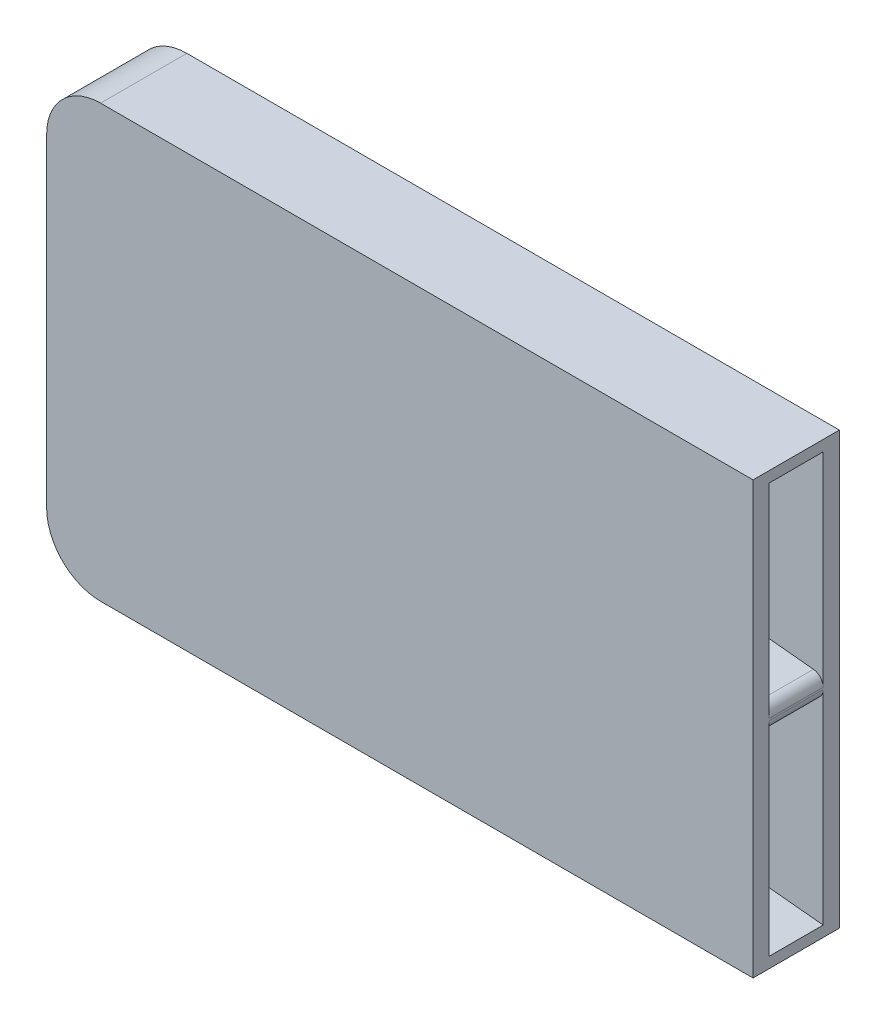
ISO-10303-21;
HEADER;
FILE_DESCRIPTION(('STEP AP214'),'2;1');
FILE_NAME('part.step','',(''),(''),'','','');
FILE_SCHEMA(('AUTOMOTIVE_DESIGN { 1 0 10303 214 1 1 1 1 }'));
ENDSEC;
DATA;
#1=APPLICATION_CONTEXT('core data for automotive mechanical design processes');
#2=APPLICATION_PROTOCOL_DEFINITION('international standard','automotive_design',2000,#1);
#3=PRODUCT_CONTEXT('',#1,'mechanical');
#4=PRODUCT('Part','Part','',(#3));
#5=PRODUCT_RELATED_PRODUCT_CATEGORY('part','',(#4));
#6=PRODUCT_DEFINITION_FORMATION('','',#4);
#7=PRODUCT_DEFINITION_CONTEXT('part definition',#1,'design');
#8=PRODUCT_DEFINITION('design','',#6,#7);
#9=PRODUCT_DEFINITION_SHAPE('','',#8);
#10=(LENGTH_UNIT() NAMED_UNIT(*) SI_UNIT(.MILLI.,.METRE.));
#11=(NAMED_UNIT(*) PLANE_ANGLE_UNIT() SI_UNIT($,.RADIAN.));
#12=(NAMED_UNIT(*) SI_UNIT($,.STERADIAN.) SOLID_ANGLE_UNIT());
#13=UNCERTAINTY_MEASURE_WITH_UNIT(LENGTH_MEASURE(1.E-05),#10,'distance_accuracy_value','');
#14=(GEOMETRIC_REPRESENTATION_CONTEXT(3) GLOBAL_UNCERTAINTY_ASSIGNED_CONTEXT((#13)) GLOBAL_UNIT_ASSIGNED_CONTEXT((#10,
#11,#12)) REPRESENTATION_CONTEXT('',''));
#15=CARTESIAN_POINT('',(0.,0.,0.));
#16=DIRECTION('',(0.,0.,1.));
#17=DIRECTION('',(1.,0.,0.));
#18=AXIS2_PLACEMENT_3D('',#15,#16,#17);
#19=CARTESIAN_POINT('',(0.,0.,0.));
#20=DIRECTION('',(0.,0.,1.));
#21=DIRECTION('',(1.,0.,0.));
#22=AXIS2_PLACEMENT_3D('',#19,#20,#21);
#23=PLANE('',#22);
#24=DIRECTION('',(0.995112116617697,-0.0987515840918325,0.));
#25=VECTOR('',#24,1.);
#26=CARTESIAN_POINT('',(0.737016733987305,7.42686093479516,0.));
#27=LINE('',#26,#25);
#28=CARTESIAN_POINT('',(0.,7.5,0.));
#29=VERTEX_POINT('',#28);
#30=CARTESIAN_POINT('',(65.5,1.00000000000001,0.));
#31=VERTEX_POINT('',#30);
#32=EDGE_CURVE('E177',#29,#31,#27,.T.);
#33=ORIENTED_EDGE('',*,*,#32,.T.);
#34=DIRECTION('',(0.,-1.,0.));
#35=VECTOR('',#34,1.);
#36=CARTESIAN_POINT('',(65.5,0.,0.));
#37=LINE('',#36,#35);
#38=CARTESIAN_POINT('',(65.5,19.9056752509169,0.));
#39=VERTEX_POINT('',#38);
#40=EDGE_CURVE('E234',#39,#31,#37,.T.);
#41=ORIENTED_EDGE('',*,*,#40,.F.);
#42=CARTESIAN_POINT('',(64.5,19.9056752509169,0.));
#43=DIRECTION('',(0.,0.,1.));
#44=DIRECTION('',(1.,0.,0.));
#45=AXIS2_PLACEMENT_3D('',#42,#43,#44);
#46=CIRCLE('',#45,1.);
#47=CARTESIAN_POINT('',(64.5987515840918,18.9105631342992,0.));
#48=VERTEX_POINT('',#47);
#49=EDGE_CURVE('E43',#39,#48,#46,.F.);
#50=ORIENTED_EDGE('',*,*,#49,.T.);
#51=DIRECTION('',(0.995112116617697,0.0987515840918326,0.));
#52=VECTOR('',#51,1.);
#53=CARTESIAN_POINT('',(-1.22836122331218,12.3781015579919,0.));
#54=LINE('',#53,#52);
#55=CARTESIAN_POINT('',(0.,12.5,0.));
#56=VERTEX_POINT('',#55);
#57=EDGE_CURVE('E201',#56,#48,#54,.T.);
#58=ORIENTED_EDGE('',*,*,#57,.F.);
#59=DIRECTION('',(0.,1.,0.));
#60=VECTOR('',#59,1.);
#61=CARTESIAN_POINT('',(0.,0.,0.));
#62=LINE('',#61,#60);
#63=EDGE_CURVE('E233',#29,#56,#62,.T.);
#64=ORIENTED_EDGE('',*,*,#63,.F.);
#65=EDGE_LOOP('',(#33,#41,#50,#58,#64));
#66=FACE_BOUND('',#65,.T.);
#67=ADVANCED_FACE('F35',(#66),#23,.T.);
#68=CARTESIAN_POINT('',(0.,0.,-1.5));
#69=DIRECTION('',(1.,0.,0.));
#70=DIRECTION('',(0.,1.,0.));
#71=AXIS2_PLACEMENT_3D('',#68,#69,#70);
#72=PLANE('',#71);
#73=DIRECTION('',(0.,1.,0.));
#74=VECTOR('',#73,1.);
#75=CARTESIAN_POINT('',(0.,0.,6.5));
#76=LINE('',#75,#74);
#77=CARTESIAN_POINT('',(0.,5.,6.5));
#78=VERTEX_POINT('',#77);
#79=CARTESIAN_POINT('',(0.,35.,6.5));
#80=VERTEX_POINT('',#79);
#81=EDGE_CURVE('E170',#78,#80,#76,.T.);
#82=ORIENTED_EDGE('',*,*,#81,.T.);
#83=DIRECTION('',(0.,0.,1.));
#84=VECTOR('',#83,1.);
#85=CARTESIAN_POINT('',(0.,35.,-1.5));
#86=LINE('',#85,#84);
#87=CARTESIAN_POINT('',(0.,35.,-1.5));
#88=VERTEX_POINT('',#87);
#89=EDGE_CURVE('E253',#80,#88,#86,.F.);
#90=ORIENTED_EDGE('',*,*,#89,.T.);
#91=DIRECTION('',(0.,1.,0.));
#92=VECTOR('',#91,1.);
#93=CARTESIAN_POINT('',(0.,0.,-1.5));
#94=LINE('',#93,#92);
#95=CARTESIAN_POINT('',(0.,5.,-1.5));
#96=VERTEX_POINT('',#95);
#97=EDGE_CURVE('E217',#96,#88,#94,.T.);
#98=ORIENTED_EDGE('',*,*,#97,.F.);
#99=DIRECTION('',(0.,0.,1.));
#100=VECTOR('',#99,1.);
#101=CARTESIAN_POINT('',(0.,5.,-1.5));
#102=LINE('',#101,#100);
#103=EDGE_CURVE('E250',#96,#78,#102,.T.);
#104=ORIENTED_EDGE('',*,*,#103,.T.);
#105=EDGE_LOOP('',(#82,#90,#98,#104));
#106=FACE_BOUND('',#105,.T.);
#107=DIRECTION('',(0.,1.,0.));
#108=VECTOR('',#107,1.);
#109=CARTESIAN_POINT('',(0.,0.,5.));
#110=LINE('',#109,#108);
#111=CARTESIAN_POINT('',(0.,27.5,5.));
#112=VERTEX_POINT('',#111);
#113=CARTESIAN_POINT('',(0.,32.5,5.));
#114=VERTEX_POINT('',#113);
#115=EDGE_CURVE('E181',#112,#114,#110,.T.);
#116=ORIENTED_EDGE('',*,*,#115,.F.);
#117=DIRECTION('',(0.,0.,-1.));
#118=VECTOR('',#117,1.);
#119=CARTESIAN_POINT('',(0.,27.5,5.));
#120=LINE('',#119,#118);
#121=CARTESIAN_POINT('',(0.,27.5,0.));
#122=VERTEX_POINT('',#121);
#123=EDGE_CURVE('E209',#112,#122,#120,.T.);
#124=ORIENTED_EDGE('',*,*,#123,.T.);
#125=CARTESIAN_POINT('',(0.,32.5,0.));
#126=VERTEX_POINT('',#125);
#127=EDGE_CURVE('E228',#122,#126,#62,.T.);
#128=ORIENTED_EDGE('',*,*,#127,.T.);
#129=DIRECTION('',(0.,0.,-1.));
#130=VECTOR('',#129,1.);
#131=CARTESIAN_POINT('',(0.,32.5,5.));
#132=LINE('',#131,#130);
#133=EDGE_CURVE('E225',#114,#126,#132,.T.);
#134=ORIENTED_EDGE('',*,*,#133,.F.);
#135=EDGE_LOOP('',(#116,#124,#128,#134));
#136=FACE_BOUND('',#135,.T.);
#137=DIRECTION('',(0.,0.,-1.));
#138=VECTOR('',#137,1.);
#139=CARTESIAN_POINT('',(0.,12.5,5.));
#140=LINE('',#139,#138);
#141=CARTESIAN_POINT('',(0.,12.5,5.));
#142=VERTEX_POINT('',#141);
#143=EDGE_CURVE('E203',#142,#56,#140,.T.);
#144=ORIENTED_EDGE('',*,*,#143,.F.);
#145=CARTESIAN_POINT('',(0.,7.5,5.));
#146=VERTEX_POINT('',#145);
#147=EDGE_CURVE('E183',#146,#142,#110,.T.);
#148=ORIENTED_EDGE('',*,*,#147,.F.);
#149=DIRECTION('',(0.,0.,-1.));
#150=VECTOR('',#149,1.);
#151=CARTESIAN_POINT('',(0.,7.5,5.));
#152=LINE('',#151,#150);
#153=EDGE_CURVE('E194',#146,#29,#152,.T.);
#154=ORIENTED_EDGE('',*,*,#153,.T.);
#155=ORIENTED_EDGE('',*,*,#63,.T.);
#156=EDGE_LOOP('',(#144,#148,#154,#155));
#157=FACE_BOUND('',#156,.T.);
#158=ADVANCED_FACE('F296',(#106,#136,#157),#72,.F.);
#159=CARTESIAN_POINT('',(0.,40.,-1.5));
#160=DIRECTION('',(0.,-1.,0.));
#161=DIRECTION('',(1.,0.,0.));
#162=AXIS2_PLACEMENT_3D('',#159,#160,#161);
#163=PLANE('',#162);
#164=DIRECTION('',(1.,0.,0.));
#165=VECTOR('',#164,1.);
#166=CARTESIAN_POINT('',(0.,40.,-1.5));
#167=LINE('',#166,#165);
#168=CARTESIAN_POINT('',(5.00000000000001,40.,-1.5));
#169=VERTEX_POINT('',#168);
#170=CARTESIAN_POINT('',(65.5,40.,-1.5));
#171=VERTEX_POINT('',#170);
#172=EDGE_CURVE('E161',#169,#171,#167,.T.);
#173=ORIENTED_EDGE('',*,*,#172,.F.);
#174=DIRECTION('',(0.,0.,1.));
#175=VECTOR('',#174,1.);
#176=CARTESIAN_POINT('',(5.00000000000001,40.,-1.5));
#177=LINE('',#176,#175);
#178=CARTESIAN_POINT('',(5.00000000000001,40.,6.5));
#179=VERTEX_POINT('',#178);
#180=EDGE_CURVE('E244',#169,#179,#177,.T.);
#181=ORIENTED_EDGE('',*,*,#180,.T.);
#182=DIRECTION('',(1.,0.,0.));
#183=VECTOR('',#182,1.);
#184=CARTESIAN_POINT('',(0.,40.,6.5));
#185=LINE('',#184,#183);
#186=CARTESIAN_POINT('',(65.5,40.,6.5));
#187=VERTEX_POINT('',#186);
#188=EDGE_CURVE('E175',#179,#187,#185,.T.);
#189=ORIENTED_EDGE('',*,*,#188,.T.);
#190=DIRECTION('',(0.,0.,1.));
#191=VECTOR('',#190,1.);
#192=CARTESIAN_POINT('',(65.5,40.,-1.5));
#193=LINE('',#192,#191);
#194=EDGE_CURVE('E160',#171,#187,#193,.T.);
#195=ORIENTED_EDGE('',*,*,#194,.F.);
#196=EDGE_LOOP('',(#173,#181,#189,#195));
#197=FACE_BOUND('',#196,.T.);
#198=ADVANCED_FACE('F334',(#197),#163,.F.);
#199=CARTESIAN_POINT('',(65.5,0.,-1.5));
#200=DIRECTION('',(-1.,0.,0.));
#201=DIRECTION('',(0.,0.,1.));
#202=AXIS2_PLACEMENT_3D('',#199,#200,#201);
#203=PLANE('',#202);
#204=CARTESIAN_POINT('',(65.5,39.,0.));
#205=VERTEX_POINT('',#204);
#206=CARTESIAN_POINT('',(65.5,20.0943247490831,0.));
#207=VERTEX_POINT('',#206);
#208=EDGE_CURVE('E291',#205,#207,#37,.T.);
#209=ORIENTED_EDGE('',*,*,#208,.T.);
#210=DIRECTION('',(0.,0.,-1.));
#211=VECTOR('',#210,1.);
#212=CARTESIAN_POINT('',(65.5,20.0943247490831,5.));
#213=LINE('',#212,#211);
#214=CARTESIAN_POINT('',(65.5,20.0943247490831,5.));
#215=VERTEX_POINT('',#214);
#216=EDGE_CURVE('E267',#207,#215,#213,.F.);
#217=ORIENTED_EDGE('',*,*,#216,.T.);
#218=DIRECTION('',(0.,-1.,0.));
#219=VECTOR('',#218,1.);
#220=CARTESIAN_POINT('',(65.5,0.,5.));
#221=LINE('',#220,#219);
#222=CARTESIAN_POINT('',(65.5,39.,5.));
#223=VERTEX_POINT('',#222);
#224=EDGE_CURVE('E186',#223,#215,#221,.T.);
#225=ORIENTED_EDGE('',*,*,#224,.F.);
#226=DIRECTION('',(0.,0.,-1.));
#227=VECTOR('',#226,1.);
#228=CARTESIAN_POINT('',(65.5,39.,5.));
#229=LINE('',#228,#227);
#230=EDGE_CURVE('E214',#223,#205,#229,.T.);
#231=ORIENTED_EDGE('',*,*,#230,.T.);
#232=EDGE_LOOP('',(#209,#217,#225,#231));
#233=FACE_BOUND('',#232,.T.);
#234=DIRECTION('',(0.,0.,-1.));
#235=VECTOR('',#234,1.);
#236=CARTESIAN_POINT('',(65.5,19.9056752509169,-1.5));
#237=LINE('',#236,#235);
#238=CARTESIAN_POINT('',(65.5,19.9056752509169,5.));
#239=VERTEX_POINT('',#238);
#240=EDGE_CURVE('E264',#239,#39,#237,.T.);
#241=ORIENTED_EDGE('',*,*,#240,.T.);
#242=ORIENTED_EDGE('',*,*,#40,.T.);
#243=DIRECTION('',(0.,0.,-1.));
#244=VECTOR('',#243,1.);
#245=CARTESIAN_POINT('',(65.5,1.00000000000001,5.));
#246=LINE('',#245,#244);
#247=CARTESIAN_POINT('',(65.5,1.00000000000001,5.));
#248=VERTEX_POINT('',#247);
#249=EDGE_CURVE('E190',#248,#31,#246,.T.);
#250=ORIENTED_EDGE('',*,*,#249,.F.);
#251=EDGE_CURVE('E184',#239,#248,#221,.T.);
#252=ORIENTED_EDGE('',*,*,#251,.F.);
#253=EDGE_LOOP('',(#241,#242,#250,#252));
#254=FACE_BOUND('',#253,.T.);
#255=ORIENTED_EDGE('',*,*,#194,.T.);
#256=DIRECTION('',(0.,-1.,0.));
#257=VECTOR('',#256,1.);
#258=CARTESIAN_POINT('',(65.5,0.,6.5));
#259=LINE('',#258,#257);
#260=CARTESIAN_POINT('',(65.5,0.,6.5));
#261=VERTEX_POINT('',#260);
#262=EDGE_CURVE('E167',#187,#261,#259,.T.);
#263=ORIENTED_EDGE('',*,*,#262,.T.);
#264=DIRECTION('',(0.,0.,1.));
#265=VECTOR('',#264,1.);
#266=CARTESIAN_POINT('',(65.5,0.,-1.5));
#267=LINE('',#266,#265);
#268=CARTESIAN_POINT('',(65.5,0.,-1.5));
#269=VERTEX_POINT('',#268);
#270=EDGE_CURVE('E150',#269,#261,#267,.T.);
#271=ORIENTED_EDGE('',*,*,#270,.F.);
#272=DIRECTION('',(0.,-1.,0.));
#273=VECTOR('',#272,1.);
#274=CARTESIAN_POINT('',(65.5,0.,-1.5));
#275=LINE('',#274,#273);
#276=EDGE_CURVE('E546',#171,#269,#275,.T.);
#277=ORIENTED_EDGE('',*,*,#276,.F.);
#278=EDGE_LOOP('',(#255,#263,#271,#277));
#279=FACE_BOUND('',#278,.T.);
#280=ADVANCED_FACE('F173',(#233,#254,#279),#203,.F.);
#281=CARTESIAN_POINT('',(0.,0.,-1.5));
#282=DIRECTION('',(0.,1.,0.));
#283=DIRECTION('',(-1.,0.,0.));
#284=AXIS2_PLACEMENT_3D('',#281,#282,#283);
#285=PLANE('',#284);
#286=DIRECTION('',(-1.,0.,0.));
#287=VECTOR('',#286,1.);
#288=CARTESIAN_POINT('',(0.,0.,6.5));
#289=LINE('',#288,#287);
#290=CARTESIAN_POINT('',(5.,0.,6.5));
#291=VERTEX_POINT('',#290);
#292=EDGE_CURVE('E153',#261,#291,#289,.T.);
#293=ORIENTED_EDGE('',*,*,#292,.T.);
#294=DIRECTION('',(0.,0.,1.));
#295=VECTOR('',#294,1.);
#296=CARTESIAN_POINT('',(5.,0.,-1.5));
#297=LINE('',#296,#295);
#298=CARTESIAN_POINT('',(5.,0.,-1.5));
#299=VERTEX_POINT('',#298);
#300=EDGE_CURVE('E259',#291,#299,#297,.F.);
#301=ORIENTED_EDGE('',*,*,#300,.T.);
#302=DIRECTION('',(-1.,0.,0.));
#303=VECTOR('',#302,1.);
#304=CARTESIAN_POINT('',(0.,0.,-1.5));
#305=LINE('',#304,#303);
#306=EDGE_CURVE('E156',#269,#299,#305,.T.);
#307=ORIENTED_EDGE('',*,*,#306,.F.);
#308=ORIENTED_EDGE('',*,*,#270,.T.);
#309=EDGE_LOOP('',(#293,#301,#307,#308));
#310=FACE_BOUND('',#309,.T.);
#311=ADVANCED_FACE('F152',(#310),#285,.F.);
#312=CARTESIAN_POINT('',(0.,0.,-1.5));
#313=DIRECTION('',(0.,0.,1.));
#314=DIRECTION('',(1.,0.,0.));
#315=AXIS2_PLACEMENT_3D('',#312,#313,#314);
#316=PLANE('',#315);
#317=ORIENTED_EDGE('',*,*,#97,.T.);
#318=CARTESIAN_POINT('',(5.00000000000001,35.,-1.5));
#319=DIRECTION('',(0.,0.,1.));
#320=DIRECTION('',(1.,0.,0.));
#321=AXIS2_PLACEMENT_3D('',#318,#319,#320);
#322=CIRCLE('',#321,5.);
#323=EDGE_CURVE('E257',#88,#169,#322,.F.);
#324=ORIENTED_EDGE('',*,*,#323,.T.);
#325=ORIENTED_EDGE('',*,*,#172,.T.);
#326=ORIENTED_EDGE('',*,*,#276,.T.);
#327=ORIENTED_EDGE('',*,*,#306,.T.);
#328=CARTESIAN_POINT('',(5.,5.,-1.5));
#329=DIRECTION('',(0.,0.,1.));
#330=DIRECTION('',(1.,0.,0.));
#331=AXIS2_PLACEMENT_3D('',#328,#329,#330);
#332=CIRCLE('',#331,5.);
#333=EDGE_CURVE('E255',#299,#96,#332,.F.);
#334=ORIENTED_EDGE('',*,*,#333,.T.);
#335=EDGE_LOOP('',(#317,#324,#325,#326,#327,#334));
#336=FACE_BOUND('',#335,.T.);
#337=ADVANCED_FACE('F340',(#336),#316,.F.);
#338=DIRECTION('',(0.995112116617697,-0.0987515840918326,0.));
#339=VECTOR('',#338,1.);
#340=CARTESIAN_POINT('',(2.70239469128679,27.2318234275822,0.));
#341=LINE('',#340,#339);
#342=CARTESIAN_POINT('',(64.5987515840918,21.0894368657008,0.));
#343=VERTEX_POINT('',#342);
#344=EDGE_CURVE('E196',#122,#343,#341,.T.);
#345=ORIENTED_EDGE('',*,*,#344,.T.);
#346=CARTESIAN_POINT('',(64.5,20.0943247490831,0.));
#347=DIRECTION('',(0.,0.,1.));
#348=DIRECTION('',(1.,0.,0.));
#349=AXIS2_PLACEMENT_3D('',#346,#347,#348);
#350=CIRCLE('',#349,1.);
#351=EDGE_CURVE('E271',#343,#207,#350,.F.);
#352=ORIENTED_EDGE('',*,*,#351,.T.);
#353=ORIENTED_EDGE('',*,*,#208,.F.);
#354=DIRECTION('',(0.995112116617697,0.0987515840918324,0.));
#355=VECTOR('',#354,1.);
#356=CARTESIAN_POINT('',(-3.19373918061165,32.183064050779,0.));
#357=LINE('',#356,#355);
#358=EDGE_CURVE('E211',#126,#205,#357,.T.);
#359=ORIENTED_EDGE('',*,*,#358,.F.);
#360=ORIENTED_EDGE('',*,*,#127,.F.);
#361=EDGE_LOOP('',(#345,#352,#353,#359,#360));
#362=FACE_BOUND('',#361,.T.);
#363=ADVANCED_FACE('F289',(#362),#23,.T.);
#364=CARTESIAN_POINT('',(-3.19373918061165,32.183064050779,5.));
#365=DIRECTION('',(-0.0987515840918324,0.995112116617697,0.));
#366=DIRECTION('',(-0.995112116617697,-0.0987515840918324,0.));
#367=AXIS2_PLACEMENT_3D('',#364,#365,#366);
#368=PLANE('',#367);
#369=ORIENTED_EDGE('',*,*,#358,.T.);
#370=ORIENTED_EDGE('',*,*,#230,.F.);
#371=DIRECTION('',(0.995112116617697,0.0987515840918324,0.));
#372=VECTOR('',#371,1.);
#373=CARTESIAN_POINT('',(-3.19373918061165,32.183064050779,5.));
#374=LINE('',#373,#372);
#375=EDGE_CURVE('E212',#114,#223,#374,.T.);
#376=ORIENTED_EDGE('',*,*,#375,.F.);
#377=ORIENTED_EDGE('',*,*,#133,.T.);
#378=EDGE_LOOP('',(#369,#370,#376,#377));
#379=FACE_BOUND('',#378,.T.);
#380=ADVANCED_FACE('F303',(#379),#368,.F.);
#381=CARTESIAN_POINT('',(2.70239469128679,27.2318234275822,5.));
#382=DIRECTION('',(0.0987515840918326,0.995112116617697,0.));
#383=DIRECTION('',(-0.995112116617697,0.0987515840918326,0.));
#384=AXIS2_PLACEMENT_3D('',#381,#382,#383);
#385=PLANE('',#384);
#386=DIRECTION('',(0.995112116617697,-0.0987515840918326,0.));
#387=VECTOR('',#386,1.);
#388=CARTESIAN_POINT('',(2.70239469128679,27.2318234275822,5.));
#389=LINE('',#388,#387);
#390=CARTESIAN_POINT('',(64.5987515840918,21.0894368657008,5.));
#391=VERTEX_POINT('',#390);
#392=EDGE_CURVE('E197',#112,#391,#389,.T.);
#393=ORIENTED_EDGE('',*,*,#392,.T.);
#394=DIRECTION('',(0.,0.,-1.));
#395=VECTOR('',#394,1.);
#396=CARTESIAN_POINT('',(64.5987515840918,21.0894368657008,0.));
#397=LINE('',#396,#395);
#398=EDGE_CURVE('E261',#391,#343,#397,.T.);
#399=ORIENTED_EDGE('',*,*,#398,.T.);
#400=ORIENTED_EDGE('',*,*,#344,.F.);
#401=ORIENTED_EDGE('',*,*,#123,.F.);
#402=EDGE_LOOP('',(#393,#399,#400,#401));
#403=FACE_BOUND('',#402,.T.);
#404=ADVANCED_FACE('F285',(#403),#385,.T.);
#405=CARTESIAN_POINT('',(-1.22836122331218,12.3781015579919,5.));
#406=DIRECTION('',(-0.0987515840918326,0.995112116617697,0.));
#407=DIRECTION('',(-0.995112116617697,-0.0987515840918326,0.));
#408=AXIS2_PLACEMENT_3D('',#405,#406,#407);
#409=PLANE('',#408);
#410=ORIENTED_EDGE('',*,*,#57,.T.);
#411=DIRECTION('',(0.,0.,-1.));
#412=VECTOR('',#411,1.);
#413=CARTESIAN_POINT('',(64.5987515840918,18.9105631342992,5.));
#414=LINE('',#413,#412);
#415=CARTESIAN_POINT('',(64.5987515840918,18.9105631342992,5.));
#416=VERTEX_POINT('',#415);
#417=EDGE_CURVE('E50',#48,#416,#414,.F.);
#418=ORIENTED_EDGE('',*,*,#417,.T.);
#419=DIRECTION('',(0.995112116617697,0.0987515840918326,0.));
#420=VECTOR('',#419,1.);
#421=CARTESIAN_POINT('',(-1.22836122331218,12.3781015579919,5.));
#422=LINE('',#421,#420);
#423=EDGE_CURVE('E200',#142,#416,#422,.T.);
#424=ORIENTED_EDGE('',*,*,#423,.F.);
#425=ORIENTED_EDGE('',*,*,#143,.T.);
#426=EDGE_LOOP('',(#410,#418,#424,#425));
#427=FACE_BOUND('',#426,.T.);
#428=ADVANCED_FACE('F317',(#427),#409,.F.);
#429=CARTESIAN_POINT('',(0.737016733987305,7.42686093479516,5.));
#430=DIRECTION('',(0.0987515840918325,0.995112116617697,0.));
#431=DIRECTION('',(-0.995112116617697,0.0987515840918325,0.));
#432=AXIS2_PLACEMENT_3D('',#429,#430,#431);
#433=PLANE('',#432);
#434=ORIENTED_EDGE('',*,*,#32,.F.);
#435=ORIENTED_EDGE('',*,*,#153,.F.);
#436=DIRECTION('',(0.995112116617697,-0.0987515840918325,0.));
#437=VECTOR('',#436,1.);
#438=CARTESIAN_POINT('',(0.737016733987305,7.42686093479516,5.));
#439=LINE('',#438,#437);
#440=EDGE_CURVE('E187',#146,#248,#439,.T.);
#441=ORIENTED_EDGE('',*,*,#440,.T.);
#442=ORIENTED_EDGE('',*,*,#249,.T.);
#443=EDGE_LOOP('',(#434,#435,#441,#442));
#444=FACE_BOUND('',#443,.T.);
#445=ADVANCED_FACE('F320',(#444),#433,.T.);
#446=CARTESIAN_POINT('',(0.,0.,5.));
#447=DIRECTION('',(0.,0.,1.));
#448=DIRECTION('',(1.,0.,0.));
#449=AXIS2_PLACEMENT_3D('',#446,#447,#448);
#450=PLANE('',#449);
#451=ORIENTED_EDGE('',*,*,#115,.T.);
#452=ORIENTED_EDGE('',*,*,#375,.T.);
#453=ORIENTED_EDGE('',*,*,#224,.T.);
#454=CARTESIAN_POINT('',(64.5,20.0943247490831,5.));
#455=DIRECTION('',(0.,0.,1.));
#456=DIRECTION('',(1.,0.,0.));
#457=AXIS2_PLACEMENT_3D('',#454,#455,#456);
#458=CIRCLE('',#457,1.);
#459=EDGE_CURVE('E274',#215,#391,#458,.T.);
#460=ORIENTED_EDGE('',*,*,#459,.T.);
#461=ORIENTED_EDGE('',*,*,#392,.F.);
#462=EDGE_LOOP('',(#451,#452,#453,#460,#461));
#463=FACE_BOUND('',#462,.T.);
#464=ADVANCED_FACE('F277',(#463),#450,.F.);
#465=ORIENTED_EDGE('',*,*,#147,.T.);
#466=ORIENTED_EDGE('',*,*,#423,.T.);
#467=CARTESIAN_POINT('',(64.5,19.9056752509169,5.));
#468=DIRECTION('',(0.,0.,1.));
#469=DIRECTION('',(1.,0.,0.));
#470=AXIS2_PLACEMENT_3D('',#467,#468,#469);
#471=CIRCLE('',#470,1.);
#472=EDGE_CURVE('E11',#416,#239,#471,.T.);
#473=ORIENTED_EDGE('',*,*,#472,.T.);
#474=ORIENTED_EDGE('',*,*,#251,.T.);
#475=ORIENTED_EDGE('',*,*,#440,.F.);
#476=EDGE_LOOP('',(#465,#466,#473,#474,#475));
#477=FACE_BOUND('',#476,.T.);
#478=ADVANCED_FACE('F314',(#477),#450,.F.);
#479=CARTESIAN_POINT('',(0.,0.,6.5));
#480=DIRECTION('',(0.,0.,1.));
#481=DIRECTION('',(1.,0.,0.));
#482=AXIS2_PLACEMENT_3D('',#479,#480,#481);
#483=PLANE('',#482);
#484=ORIENTED_EDGE('',*,*,#188,.F.);
#485=CARTESIAN_POINT('',(5.00000000000001,35.,6.5));
#486=DIRECTION('',(0.,0.,1.));
#487=DIRECTION('',(1.,0.,0.));
#488=AXIS2_PLACEMENT_3D('',#485,#486,#487);
#489=CIRCLE('',#488,5.);
#490=EDGE_CURVE('E248',#179,#80,#489,.T.);
#491=ORIENTED_EDGE('',*,*,#490,.T.);
#492=ORIENTED_EDGE('',*,*,#81,.F.);
#493=CARTESIAN_POINT('',(5.,5.,6.5));
#494=DIRECTION('',(0.,0.,1.));
#495=DIRECTION('',(1.,0.,0.));
#496=AXIS2_PLACEMENT_3D('',#493,#494,#495);
#497=CIRCLE('',#496,5.);
#498=EDGE_CURVE('E169',#78,#291,#497,.T.);
#499=ORIENTED_EDGE('',*,*,#498,.T.);
#500=ORIENTED_EDGE('',*,*,#292,.F.);
#501=ORIENTED_EDGE('',*,*,#262,.F.);
#502=EDGE_LOOP('',(#484,#491,#492,#499,#500,#501));
#503=FACE_BOUND('',#502,.T.);
#504=ADVANCED_FACE('F166',(#503),#483,.T.);
#505=CARTESIAN_POINT('',(5.00000000000001,35.,-1.5));
#506=DIRECTION('',(0.,0.,1.));
#507=DIRECTION('',(1.,0.,0.));
#508=AXIS2_PLACEMENT_3D('',#505,#506,#507);
#509=CYLINDRICAL_SURFACE('',#508,5.);
#510=ORIENTED_EDGE('',*,*,#323,.F.);
#511=ORIENTED_EDGE('',*,*,#89,.F.);
#512=ORIENTED_EDGE('',*,*,#490,.F.);
#513=ORIENTED_EDGE('',*,*,#180,.F.);
#514=EDGE_LOOP('',(#510,#511,#512,#513));
#515=FACE_BOUND('',#514,.T.);
#516=ADVANCED_FACE('F404',(#515),#509,.T.);
#517=CARTESIAN_POINT('',(5.,5.,-1.5));
#518=DIRECTION('',(0.,0.,1.));
#519=DIRECTION('',(1.,0.,0.));
#520=AXIS2_PLACEMENT_3D('',#517,#518,#519);
#521=CYLINDRICAL_SURFACE('',#520,5.);
#522=ORIENTED_EDGE('',*,*,#333,.F.);
#523=ORIENTED_EDGE('',*,*,#300,.F.);
#524=ORIENTED_EDGE('',*,*,#498,.F.);
#525=ORIENTED_EDGE('',*,*,#103,.F.);
#526=EDGE_LOOP('',(#522,#523,#524,#525));
#527=FACE_BOUND('',#526,.T.);
#528=ADVANCED_FACE('F389',(#527),#521,.T.);
#529=CARTESIAN_POINT('',(64.5,20.0943247490831,5.));
#530=DIRECTION('',(0.,0.,1.));
#531=DIRECTION('',(1.,0.,0.));
#532=AXIS2_PLACEMENT_3D('',#529,#530,#531);
#533=CYLINDRICAL_SURFACE('',#532,1.);
#534=ORIENTED_EDGE('',*,*,#459,.F.);
#535=ORIENTED_EDGE('',*,*,#216,.F.);
#536=ORIENTED_EDGE('',*,*,#351,.F.);
#537=ORIENTED_EDGE('',*,*,#398,.F.);
#538=EDGE_LOOP('',(#534,#535,#536,#537));
#539=FACE_BOUND('',#538,.T.);
#540=ADVANCED_FACE('F287',(#539),#533,.T.);
#541=CARTESIAN_POINT('',(64.5,19.9056752509169,-1.5));
#542=DIRECTION('',(0.,0.,-1.));
#543=DIRECTION('',(-1.,0.,0.));
#544=AXIS2_PLACEMENT_3D('',#541,#542,#543);
#545=CYLINDRICAL_SURFACE('',#544,1.);
#546=ORIENTED_EDGE('',*,*,#472,.F.);
#547=ORIENTED_EDGE('',*,*,#417,.F.);
#548=ORIENTED_EDGE('',*,*,#49,.F.);
#549=ORIENTED_EDGE('',*,*,#240,.F.);
#550=EDGE_LOOP('',(#546,#547,#548,#549));
#551=FACE_BOUND('',#550,.T.);
#552=ADVANCED_FACE('F37',(#551),#545,.T.);
#553=CLOSED_SHELL('',(#67,#158,#198,#280,#311,#337,#363,#380,#404,#428,#445,#464,#478,#504,#516,
#528,#540,#552));
#554=MANIFOLD_SOLID_BREP('B2',#553);
#555=ADVANCED_BREP_SHAPE_REPRESENTATION('',(#18,#554),#14);
#556=SHAPE_DEFINITION_REPRESENTATION(#9,#555);
ENDSEC;
END-ISO-10303-21;
